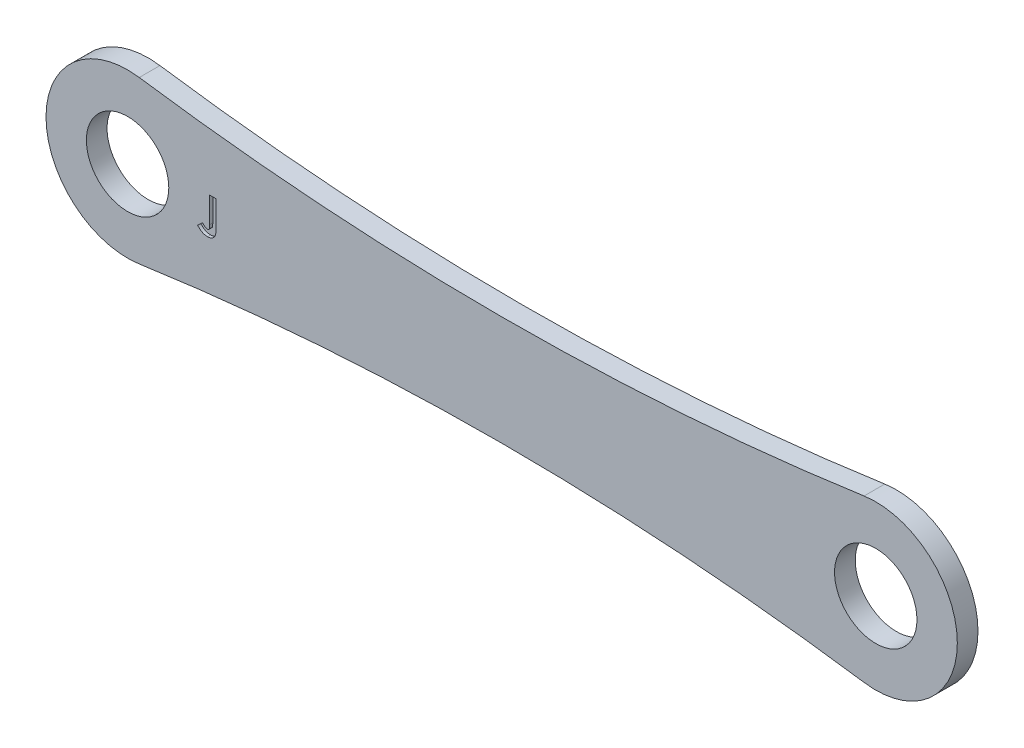
ISO-10303-21;
HEADER;
FILE_DESCRIPTION(('STEP AP214'),'2;1');
FILE_NAME('part.step','',(''),(''),'','','');
FILE_SCHEMA(('AUTOMOTIVE_DESIGN { 1 0 10303 214 1 1 1 1 }'));
ENDSEC;
DATA;
#1=APPLICATION_CONTEXT('core data for automotive mechanical design processes');
#2=APPLICATION_PROTOCOL_DEFINITION('international standard','automotive_design',2000,#1);
#3=PRODUCT_CONTEXT('',#1,'mechanical');
#4=PRODUCT('Part','Part','',(#3));
#5=PRODUCT_RELATED_PRODUCT_CATEGORY('part','',(#4));
#6=PRODUCT_DEFINITION_FORMATION('','',#4);
#7=PRODUCT_DEFINITION_CONTEXT('part definition',#1,'design');
#8=PRODUCT_DEFINITION('design','',#6,#7);
#9=PRODUCT_DEFINITION_SHAPE('','',#8);
#10=(LENGTH_UNIT() NAMED_UNIT(*) SI_UNIT(.MILLI.,.METRE.));
#11=(NAMED_UNIT(*) PLANE_ANGLE_UNIT() SI_UNIT($,.RADIAN.));
#12=(NAMED_UNIT(*) SI_UNIT($,.STERADIAN.) SOLID_ANGLE_UNIT());
#13=UNCERTAINTY_MEASURE_WITH_UNIT(LENGTH_MEASURE(1.E-05),#10,'distance_accuracy_value','');
#14=(GEOMETRIC_REPRESENTATION_CONTEXT(3) GLOBAL_UNCERTAINTY_ASSIGNED_CONTEXT((#13)) GLOBAL_UNIT_ASSIGNED_CONTEXT((#10,
#11,#12)) REPRESENTATION_CONTEXT('',''));
#15=CARTESIAN_POINT('',(0.,0.,0.));
#16=DIRECTION('',(0.,0.,1.));
#17=DIRECTION('',(1.,0.,0.));
#18=AXIS2_PLACEMENT_3D('',#15,#16,#17);
#19=CARTESIAN_POINT('',(0.,0.,2.));
#20=DIRECTION('',(0.,0.,1.));
#21=DIRECTION('',(1.,0.,0.));
#22=AXIS2_PLACEMENT_3D('',#19,#20,#21);
#23=PLANE('',#22);
#24=CARTESIAN_POINT('',(-72.36,0.,2.));
#25=DIRECTION('',(0.,0.,1.));
#26=DIRECTION('',(1.,0.,0.));
#27=AXIS2_PLACEMENT_3D('',#24,#25,#26);
#28=CIRCLE('',#27,7.89);
#29=CARTESIAN_POINT('',(-71.2312080351141,7.80883657787823,2.));
#30=VERTEX_POINT('',#29);
#31=CARTESIAN_POINT('',(-71.2312080351141,-7.80883657787824,2.));
#32=VERTEX_POINT('',#31);
#33=EDGE_CURVE('E177',#30,#32,#28,.T.);
#34=ORIENTED_EDGE('',*,*,#33,.T.);
#35=CARTESIAN_POINT('',(-36.18,-250.288552874477,2.));
#36=DIRECTION('',(0.,0.,1.));
#37=DIRECTION('',(1.,0.,0.));
#38=AXIS2_PLACEMENT_3D('',#35,#36,#37);
#39=CIRCLE('',#38,245.);
#40=CARTESIAN_POINT('',(-1.12879196488592,-7.80883657787823,2.));
#41=VERTEX_POINT('',#40);
#42=EDGE_CURVE('E94',#32,#41,#39,.F.);
#43=ORIENTED_EDGE('',*,*,#42,.T.);
#44=CARTESIAN_POINT('',(0.,0.,2.));
#45=DIRECTION('',(0.,0.,1.));
#46=DIRECTION('',(1.,0.,0.));
#47=AXIS2_PLACEMENT_3D('',#44,#45,#46);
#48=CIRCLE('',#47,7.89);
#49=CARTESIAN_POINT('',(-1.12879196488592,7.80883657787823,2.));
#50=VERTEX_POINT('',#49);
#51=EDGE_CURVE('E183',#41,#50,#48,.T.);
#52=ORIENTED_EDGE('',*,*,#51,.T.);
#53=CARTESIAN_POINT('',(-36.18,250.288552874477,2.));
#54=DIRECTION('',(0.,0.,1.));
#55=DIRECTION('',(1.,0.,0.));
#56=AXIS2_PLACEMENT_3D('',#53,#54,#55);
#57=CIRCLE('',#56,245.);
#58=EDGE_CURVE('E186',#30,#50,#57,.T.);
#59=ORIENTED_EDGE('',*,*,#58,.F.);
#60=EDGE_LOOP('',(#34,#43,#52,#59));
#61=FACE_BOUND('',#60,.T.);
#62=CARTESIAN_POINT('',(0.,0.,2.));
#63=DIRECTION('',(0.,0.,1.));
#64=DIRECTION('',(1.,0.,0.));
#65=AXIS2_PLACEMENT_3D('',#62,#63,#64);
#66=CIRCLE('',#65,3.985);
#67=CARTESIAN_POINT('',(3.985,0.,2.));
#68=VERTEX_POINT('',#67);
#69=EDGE_CURVE('E189',#68,#68,#66,.T.);
#70=ORIENTED_EDGE('',*,*,#69,.F.);
#71=EDGE_LOOP('',(#70));
#72=FACE_BOUND('',#71,.T.);
#73=CARTESIAN_POINT('',(-72.36,0.,2.));
#74=DIRECTION('',(0.,0.,1.));
#75=DIRECTION('',(1.,0.,0.));
#76=AXIS2_PLACEMENT_3D('',#73,#74,#75);
#77=CIRCLE('',#76,3.985);
#78=CARTESIAN_POINT('',(-68.375,0.,2.));
#79=VERTEX_POINT('',#78);
#80=EDGE_CURVE('E193',#79,#79,#77,.T.);
#81=ORIENTED_EDGE('',*,*,#80,.F.);
#82=EDGE_LOOP('',(#81));
#83=FACE_BOUND('',#82,.T.);
#84=CARTESIAN_POINT('',(-64.6286490353845,-1.5975658054175,2.));
#85=CARTESIAN_POINT('',(-64.6118644782961,-1.59669051779528,2.));
#86=CARTESIAN_POINT('',(-64.5795932929608,-1.59500762744972,2.));
#87=CARTESIAN_POINT('',(-64.5352191755467,-1.57630016813973,2.));
#88=CARTESIAN_POINT('',(-64.4978089389516,-1.54692867047063,2.));
#89=CARTESIAN_POINT('',(-64.4731802472815,-1.51316232263827,2.));
#90=CARTESIAN_POINT('',(-64.4574852526347,-1.47864402467006,2.));
#91=CARTESIAN_POINT('',(-64.4476787241519,-1.44527678326616,2.));
#92=CARTESIAN_POINT('',(-64.4383723116559,-1.40527850437641,2.));
#93=CARTESIAN_POINT('',(-64.4309162215116,-1.35866923476935,2.));
#94=CARTESIAN_POINT('',(-64.4252823864001,-1.3048410202096,2.));
#95=CARTESIAN_POINT('',(-64.422474326906,-1.24444733226282,2.));
#96=CARTESIAN_POINT('',(-64.419059366383,-1.17716181280407,2.));
#97=CARTESIAN_POINT('',(-64.4190294102165,-1.13015703803754,2.));
#98=CARTESIAN_POINT('',(-64.4190136187179,-1.1053783054175,2.));
#99=B_SPLINE_CURVE_WITH_KNOTS('',3,(#84,#85,#86,#87,#88,#89,#90,#91,#92,#93,#94,#95,#96,#97,
#98),.UNSPECIFIED.,.F.,.F.,(4,1,1,1,1,1,1,1,1,1,1,1,4),(0.,0.0836606106248736,0.160851850693832,
0.236744462245986,0.319647798711953,0.367325512256422,0.426209548529814,0.493524089529685,
0.573025277738405,0.662506020502808,0.764543201859917,0.875878119325883,1.),.UNSPECIFIED.);
#100=CARTESIAN_POINT('',(-64.6286490353845,-1.5975658054175,2.));
#101=VERTEX_POINT('',#100);
#102=CARTESIAN_POINT('',(-64.4190136187179,-1.1053783054175,2.));
#103=VERTEX_POINT('',#102);
#104=EDGE_CURVE('E159',#101,#103,#99,.T.);
#105=ORIENTED_EDGE('',*,*,#104,.T.);
#106=DIRECTION('',(0.,1.,0.));
#107=VECTOR('',#106,1.);
#108=CARTESIAN_POINT('',(-64.4190136187179,-1.1053783054175,2.));
#109=LINE('',#108,#107);
#110=CARTESIAN_POINT('',(-64.4190136187179,1.36397265612096,2.));
#111=VERTEX_POINT('',#110);
#112=EDGE_CURVE('E59',#103,#111,#109,.T.);
#113=ORIENTED_EDGE('',*,*,#112,.T.);
#114=DIRECTION('',(1.,0.,0.));
#115=VECTOR('',#114,1.);
#116=CARTESIAN_POINT('',(-64.4190136187179,1.36397265612096,2.));
#117=LINE('',#116,#115);
#118=CARTESIAN_POINT('',(-63.7908084905127,1.36397265612096,2.));
#119=VERTEX_POINT('',#118);
#120=EDGE_CURVE('E163',#111,#119,#117,.T.);
#121=ORIENTED_EDGE('',*,*,#120,.T.);
#122=DIRECTION('',(0.,-1.,0.));
#123=VECTOR('',#122,1.);
#124=CARTESIAN_POINT('',(-63.7908084905127,1.36397265612096,2.));
#125=LINE('',#124,#123);
#126=CARTESIAN_POINT('',(-63.7908084905127,-0.959544972084172,2.));
#127=VERTEX_POINT('',#126);
#128=EDGE_CURVE('E396',#119,#127,#125,.T.);
#129=ORIENTED_EDGE('',*,*,#128,.T.);
#130=CARTESIAN_POINT('',(-63.7908084905127,-0.959544972084172,2.));
#131=CARTESIAN_POINT('',(-63.7910388093672,-1.00395367744763,2.));
#132=CARTESIAN_POINT('',(-63.7914825883267,-1.08952048488141,2.));
#133=CARTESIAN_POINT('',(-63.7959256028876,-1.21270510131638,2.));
#134=CARTESIAN_POINT('',(-63.8019333420481,-1.32564701040238,2.));
#135=CARTESIAN_POINT('',(-63.8105850660803,-1.42816524272144,2.));
#136=CARTESIAN_POINT('',(-63.8234352450288,-1.52025484078727,2.));
#137=CARTESIAN_POINT('',(-63.8379777458225,-1.60214555967415,2.));
#138=CARTESIAN_POINT('',(-63.8540221609034,-1.67417108119235,2.));
#139=CARTESIAN_POINT('',(-63.881125114979,-1.75477884515614,2.));
#140=CARTESIAN_POINT('',(-63.9232016657711,-1.84404277443184,2.));
#141=CARTESIAN_POINT('',(-63.9866963819806,-1.94046050316093,2.));
#142=CARTESIAN_POINT('',(-64.0657676270272,-2.02423107983365,2.));
#143=CARTESIAN_POINT('',(-64.1568315829075,-2.09699550822897,2.));
#144=CARTESIAN_POINT('',(-64.2606555308491,-2.15461117125894,2.));
#145=CARTESIAN_POINT('',(-64.3748476112268,-2.19625592675418,2.));
#146=CARTESIAN_POINT('',(-64.4990427791416,-2.22113479213677,2.));
#147=CARTESIAN_POINT('',(-64.5850635498624,-2.2241952824159,2.));
#148=CARTESIAN_POINT('',(-64.6293501571794,-2.22577093362263,2.));
#149=B_SPLINE_CURVE_WITH_KNOTS('',3,(#130,#131,#132,#133,#134,#135,#136,#137,#138,#139,#140,
#141,#142,#143,#144,#145,#146,#147,#148),.UNSPECIFIED.,.F.,.F.,(4,1,1,1,1,1,1,1,1,1,1,1,1,1,1,1,
4),(0.,0.0764053506058015,0.147218025580542,0.212058993569066,0.270999490309767,
0.324170992612473,0.371969814615873,0.414105230295778,0.450981256131896,0.518077209357028,
0.583319665547199,0.64875638268336,0.715449883456708,0.783134877260214,0.852084921522462,
0.92384796204543,1.),.UNSPECIFIED.);
#150=CARTESIAN_POINT('',(-64.6293501571794,-2.22577093362263,2.));
#151=VERTEX_POINT('',#150);
#152=EDGE_CURVE('E400',#127,#151,#149,.T.);
#153=ORIENTED_EDGE('',*,*,#152,.T.);
#154=CARTESIAN_POINT('',(-64.6293501571794,-2.22577093362263,2.));
#155=CARTESIAN_POINT('',(-64.675492771988,-2.2243424113451,2.));
#156=CARTESIAN_POINT('',(-64.766504027042,-2.22152480757708,2.));
#157=CARTESIAN_POINT('',(-64.8999814055994,-2.19752605924968,2.));
#158=CARTESIAN_POINT('',(-65.0282698518428,-2.15904884462812,2.));
#159=CARTESIAN_POINT('',(-65.1507056689292,-2.10341541025847,2.));
#160=CARTESIAN_POINT('',(-65.2689662647122,-2.03372701697355,2.));
#161=CARTESIAN_POINT('',(-65.3809053177734,-1.94728534819127,2.));
#162=CARTESIAN_POINT('',(-65.4888599618125,-1.84677133919651,2.));
#163=CARTESIAN_POINT('',(-65.5528561337854,-1.76963941121248,2.));
#164=CARTESIAN_POINT('',(-65.5856802853845,-1.73007782464827,2.));
#165=B_SPLINE_CURVE_WITH_KNOTS('',3,(#154,#155,#156,#157,#158,#159,#160,#161,#162,#163,#164),
.UNSPECIFIED.,.F.,.F.,(4,1,1,1,1,1,1,1,4),(0.,0.123873098257655,0.24432612210228,
0.363091916241502,0.48280641059897,0.604690738529228,0.731012015230366,0.862033897993615,1.),.UNSPECIFIED.);
#166=CARTESIAN_POINT('',(-65.5856802853845,-1.73007782464827,2.));
#167=VERTEX_POINT('',#166);
#168=EDGE_CURVE('E406',#151,#167,#165,.T.);
#169=ORIENTED_EDGE('',*,*,#168,.T.);
#170=DIRECTION('',(0.734180402826142,0.678954443321527,0.));
#171=VECTOR('',#170,1.);
#172=CARTESIAN_POINT('',(-65.5856802853845,-1.73007782464827,2.));
#173=LINE('',#172,#171);
#174=CARTESIAN_POINT('',(-65.1103197084615,-1.29047445926366,2.));
#175=VERTEX_POINT('',#174);
#176=EDGE_CURVE('E415',#167,#175,#173,.T.);
#177=ORIENTED_EDGE('',*,*,#176,.T.);
#178=CARTESIAN_POINT('',(-65.1103197084615,-1.29047445926366,2.));
#179=CARTESIAN_POINT('',(-65.0854303651838,-1.31861727764838,2.));
#180=CARTESIAN_POINT('',(-65.0388557126807,-1.3712800567384,2.));
#181=CARTESIAN_POINT('',(-64.9686690843899,-1.43995361405017,2.));
#182=CARTESIAN_POINT('',(-64.9053569637882,-1.49512489090156,2.));
#183=CARTESIAN_POINT('',(-64.8456745905786,-1.53492042970763,2.));
#184=CARTESIAN_POINT('',(-64.7893537667527,-1.56297184202213,2.));
#185=CARTESIAN_POINT('',(-64.7351827103125,-1.58317806297695,2.));
#186=CARTESIAN_POINT('',(-64.6814728315301,-1.59461593154351,2.));
#187=CARTESIAN_POINT('',(-64.6459904479072,-1.59659739755076,2.));
#188=CARTESIAN_POINT('',(-64.6286490353845,-1.5975658054175,2.));
#189=B_SPLINE_CURVE_WITH_KNOTS('',3,(#178,#179,#180,#181,#182,#183,#184,#185,#186,#187,#188),
.UNSPECIFIED.,.F.,.F.,(4,1,1,1,1,1,1,1,4),(0.,0.19118873467612,0.357765521601639,
0.499586074062441,0.618044672839491,0.721795541859922,0.819272160926323,0.9116723373205,1.),.UNSPECIFIED.);
#190=EDGE_CURVE('E422',#175,#101,#189,.T.);
#191=ORIENTED_EDGE('',*,*,#190,.T.);
#192=EDGE_LOOP('',(#105,#113,#121,#129,#153,#169,#177,#191));
#193=FACE_BOUND('',#192,.T.);
#194=ADVANCED_FACE('F43',(#61,#72,#83,#193),#23,.T.);
#195=CARTESIAN_POINT('',(-72.36,0.,2.));
#196=DIRECTION('',(0.,0.,-1.));
#197=DIRECTION('',(-1.,0.,0.));
#198=AXIS2_PLACEMENT_3D('',#195,#196,#197);
#199=CYLINDRICAL_SURFACE('',#198,7.89);
#200=CARTESIAN_POINT('',(-72.36,0.,0.));
#201=DIRECTION('',(0.,0.,1.));
#202=DIRECTION('',(1.,0.,0.));
#203=AXIS2_PLACEMENT_3D('',#200,#201,#202);
#204=CIRCLE('',#203,7.89);
#205=CARTESIAN_POINT('',(-71.2312080351141,7.80883657787823,0.));
#206=VERTEX_POINT('',#205);
#207=CARTESIAN_POINT('',(-71.2312080351141,-7.80883657787824,0.));
#208=VERTEX_POINT('',#207);
#209=EDGE_CURVE('E165',#206,#208,#204,.T.);
#210=ORIENTED_EDGE('',*,*,#209,.T.);
#211=DIRECTION('',(0.,0.,-1.));
#212=VECTOR('',#211,1.);
#213=CARTESIAN_POINT('',(-71.2312080351141,-7.80883657787824,2.));
#214=LINE('',#213,#212);
#215=EDGE_CURVE('E11',#32,#208,#214,.T.);
#216=ORIENTED_EDGE('',*,*,#215,.F.);
#217=ORIENTED_EDGE('',*,*,#33,.F.);
#218=DIRECTION('',(0.,0.,-1.));
#219=VECTOR('',#218,1.);
#220=CARTESIAN_POINT('',(-71.2312080351141,7.80883657787823,2.));
#221=LINE('',#220,#219);
#222=EDGE_CURVE('E68',#30,#206,#221,.T.);
#223=ORIENTED_EDGE('',*,*,#222,.T.);
#224=EDGE_LOOP('',(#210,#216,#217,#223));
#225=FACE_BOUND('',#224,.T.);
#226=ADVANCED_FACE('F45',(#225),#199,.T.);
#227=CARTESIAN_POINT('',(-36.18,-250.288552874477,2.));
#228=DIRECTION('',(0.,0.,-1.));
#229=DIRECTION('',(-1.,0.,0.));
#230=AXIS2_PLACEMENT_3D('',#227,#228,#229);
#231=CYLINDRICAL_SURFACE('',#230,245.);
#232=CARTESIAN_POINT('',(-36.18,-250.288552874477,0.));
#233=DIRECTION('',(0.,0.,1.));
#234=DIRECTION('',(1.,0.,0.));
#235=AXIS2_PLACEMENT_3D('',#232,#233,#234);
#236=CIRCLE('',#235,245.);
#237=CARTESIAN_POINT('',(-1.12879196488592,-7.80883657787823,0.));
#238=VERTEX_POINT('',#237);
#239=EDGE_CURVE('E171',#208,#238,#236,.F.);
#240=ORIENTED_EDGE('',*,*,#239,.T.);
#241=DIRECTION('',(0.,0.,-1.));
#242=VECTOR('',#241,1.);
#243=CARTESIAN_POINT('',(-1.12879196488592,-7.80883657787823,2.));
#244=LINE('',#243,#242);
#245=EDGE_CURVE('E52',#41,#238,#244,.T.);
#246=ORIENTED_EDGE('',*,*,#245,.F.);
#247=ORIENTED_EDGE('',*,*,#42,.F.);
#248=ORIENTED_EDGE('',*,*,#215,.T.);
#249=EDGE_LOOP('',(#240,#246,#247,#248));
#250=FACE_BOUND('',#249,.T.);
#251=ADVANCED_FACE('F234',(#250),#231,.F.);
#252=CARTESIAN_POINT('',(0.,0.,2.));
#253=DIRECTION('',(0.,0.,-1.));
#254=DIRECTION('',(-1.,0.,0.));
#255=AXIS2_PLACEMENT_3D('',#252,#253,#254);
#256=CYLINDRICAL_SURFACE('',#255,7.89);
#257=CARTESIAN_POINT('',(0.,0.,0.));
#258=DIRECTION('',(0.,0.,1.));
#259=DIRECTION('',(1.,0.,0.));
#260=AXIS2_PLACEMENT_3D('',#257,#258,#259);
#261=CIRCLE('',#260,7.89);
#262=CARTESIAN_POINT('',(-1.12879196488592,7.80883657787823,0.));
#263=VERTEX_POINT('',#262);
#264=EDGE_CURVE('E199',#238,#263,#261,.T.);
#265=ORIENTED_EDGE('',*,*,#264,.T.);
#266=DIRECTION('',(0.,0.,-1.));
#267=VECTOR('',#266,1.);
#268=CARTESIAN_POINT('',(-1.12879196488592,7.80883657787823,2.));
#269=LINE('',#268,#267);
#270=EDGE_CURVE('E216',#50,#263,#269,.T.);
#271=ORIENTED_EDGE('',*,*,#270,.F.);
#272=ORIENTED_EDGE('',*,*,#51,.F.);
#273=ORIENTED_EDGE('',*,*,#245,.T.);
#274=EDGE_LOOP('',(#265,#271,#272,#273));
#275=FACE_BOUND('',#274,.T.);
#276=ADVANCED_FACE('F224',(#275),#256,.T.);
#277=CARTESIAN_POINT('',(0.,0.,2.));
#278=DIRECTION('',(0.,0.,-1.));
#279=DIRECTION('',(-1.,0.,0.));
#280=AXIS2_PLACEMENT_3D('',#277,#278,#279);
#281=CYLINDRICAL_SURFACE('',#280,3.985);
#282=ORIENTED_EDGE('',*,*,#69,.T.);
#283=EDGE_LOOP('',(#282));
#284=FACE_BOUND('',#283,.T.);
#285=CARTESIAN_POINT('',(0.,0.,0.));
#286=DIRECTION('',(0.,0.,1.));
#287=DIRECTION('',(1.,0.,0.));
#288=AXIS2_PLACEMENT_3D('',#285,#286,#287);
#289=CIRCLE('',#288,3.985);
#290=CARTESIAN_POINT('',(3.985,0.,0.));
#291=VERTEX_POINT('',#290);
#292=EDGE_CURVE('E207',#291,#291,#289,.T.);
#293=ORIENTED_EDGE('',*,*,#292,.F.);
#294=EDGE_LOOP('',(#293));
#295=FACE_BOUND('',#294,.T.);
#296=ADVANCED_FACE('F240',(#284,#295),#281,.F.);
#297=CARTESIAN_POINT('',(-36.18,250.288552874477,2.));
#298=DIRECTION('',(0.,0.,-1.));
#299=DIRECTION('',(-1.,0.,0.));
#300=AXIS2_PLACEMENT_3D('',#297,#298,#299);
#301=CYLINDRICAL_SURFACE('',#300,245.);
#302=CARTESIAN_POINT('',(-36.18,250.288552874477,0.));
#303=DIRECTION('',(0.,0.,1.));
#304=DIRECTION('',(1.,0.,0.));
#305=AXIS2_PLACEMENT_3D('',#302,#303,#304);
#306=CIRCLE('',#305,245.);
#307=EDGE_CURVE('E203',#206,#263,#306,.T.);
#308=ORIENTED_EDGE('',*,*,#307,.F.);
#309=ORIENTED_EDGE('',*,*,#222,.F.);
#310=ORIENTED_EDGE('',*,*,#58,.T.);
#311=ORIENTED_EDGE('',*,*,#270,.T.);
#312=EDGE_LOOP('',(#308,#309,#310,#311));
#313=FACE_BOUND('',#312,.T.);
#314=ADVANCED_FACE('F229',(#313),#301,.F.);
#315=CARTESIAN_POINT('',(-72.36,0.,2.));
#316=DIRECTION('',(0.,0.,-1.));
#317=DIRECTION('',(-1.,0.,0.));
#318=AXIS2_PLACEMENT_3D('',#315,#316,#317);
#319=CYLINDRICAL_SURFACE('',#318,3.985);
#320=ORIENTED_EDGE('',*,*,#80,.T.);
#321=EDGE_LOOP('',(#320));
#322=FACE_BOUND('',#321,.T.);
#323=CARTESIAN_POINT('',(-72.36,0.,0.));
#324=DIRECTION('',(0.,0.,1.));
#325=DIRECTION('',(1.,0.,0.));
#326=AXIS2_PLACEMENT_3D('',#323,#324,#325);
#327=CIRCLE('',#326,3.985);
#328=CARTESIAN_POINT('',(-68.375,0.,0.));
#329=VERTEX_POINT('',#328);
#330=EDGE_CURVE('E180',#329,#329,#327,.T.);
#331=ORIENTED_EDGE('',*,*,#330,.F.);
#332=EDGE_LOOP('',(#331));
#333=FACE_BOUND('',#332,.T.);
#334=ADVANCED_FACE('F252',(#322,#333),#319,.F.);
#335=CARTESIAN_POINT('',(0.,0.,0.));
#336=DIRECTION('',(0.,0.,1.));
#337=DIRECTION('',(1.,0.,0.));
#338=AXIS2_PLACEMENT_3D('',#335,#336,#337);
#339=PLANE('',#338);
#340=ORIENTED_EDGE('',*,*,#209,.F.);
#341=ORIENTED_EDGE('',*,*,#307,.T.);
#342=ORIENTED_EDGE('',*,*,#264,.F.);
#343=ORIENTED_EDGE('',*,*,#239,.F.);
#344=EDGE_LOOP('',(#340,#341,#342,#343));
#345=FACE_BOUND('',#344,.T.);
#346=ORIENTED_EDGE('',*,*,#292,.T.);
#347=EDGE_LOOP('',(#346));
#348=FACE_BOUND('',#347,.T.);
#349=ORIENTED_EDGE('',*,*,#330,.T.);
#350=EDGE_LOOP('',(#349));
#351=FACE_BOUND('',#350,.T.);
#352=ADVANCED_FACE('F227',(#345,#348,#351),#339,.F.);
#353=CARTESIAN_POINT('',(-64.4190136187179,-1.1053783054175,1.7));
#354=DIRECTION('',(1.,0.,0.));
#355=DIRECTION('',(0.,0.,-1.));
#356=AXIS2_PLACEMENT_3D('',#353,#354,#355);
#357=PLANE('',#356);
#358=ORIENTED_EDGE('',*,*,#112,.F.);
#359=DIRECTION('',(0.,0.,1.));
#360=VECTOR('',#359,1.);
#361=CARTESIAN_POINT('',(-64.4190136187179,-1.1053783054175,1.7));
#362=LINE('',#361,#360);
#363=CARTESIAN_POINT('',(-64.4190136187179,-1.1053783054175,1.7));
#364=VERTEX_POINT('',#363);
#365=EDGE_CURVE('E157',#364,#103,#362,.T.);
#366=ORIENTED_EDGE('',*,*,#365,.F.);
#367=DIRECTION('',(0.,1.,0.));
#368=VECTOR('',#367,1.);
#369=CARTESIAN_POINT('',(-64.4190136187179,-1.1053783054175,1.7));
#370=LINE('',#369,#368);
#371=CARTESIAN_POINT('',(-64.4190136187179,1.36397265612096,1.7));
#372=VERTEX_POINT('',#371);
#373=EDGE_CURVE('E147',#364,#372,#370,.T.);
#374=ORIENTED_EDGE('',*,*,#373,.T.);
#375=DIRECTION('',(0.,0.,1.));
#376=VECTOR('',#375,1.);
#377=CARTESIAN_POINT('',(-64.4190136187179,1.36397265612096,1.7));
#378=LINE('',#377,#376);
#379=EDGE_CURVE('E156',#372,#111,#378,.T.);
#380=ORIENTED_EDGE('',*,*,#379,.T.);
#381=EDGE_LOOP('',(#358,#366,#374,#380));
#382=FACE_BOUND('',#381,.T.);
#383=ADVANCED_FACE('F155',(#382),#357,.T.);
#384=CARTESIAN_POINT('',(-64.4190136187179,1.36397265612096,1.7));
#385=DIRECTION('',(0.,-1.,0.));
#386=DIRECTION('',(0.,0.,-1.));
#387=AXIS2_PLACEMENT_3D('',#384,#385,#386);
#388=PLANE('',#387);
#389=ORIENTED_EDGE('',*,*,#120,.F.);
#390=ORIENTED_EDGE('',*,*,#379,.F.);
#391=DIRECTION('',(1.,0.,0.));
#392=VECTOR('',#391,1.);
#393=CARTESIAN_POINT('',(-64.4190136187179,1.36397265612096,1.7));
#394=LINE('',#393,#392);
#395=CARTESIAN_POINT('',(-63.7908084905127,1.36397265612096,1.7));
#396=VERTEX_POINT('',#395);
#397=EDGE_CURVE('E143',#372,#396,#394,.T.);
#398=ORIENTED_EDGE('',*,*,#397,.T.);
#399=DIRECTION('',(0.,0.,1.));
#400=VECTOR('',#399,1.);
#401=CARTESIAN_POINT('',(-63.7908084905127,1.36397265612096,1.7));
#402=LINE('',#401,#400);
#403=EDGE_CURVE('E166',#396,#119,#402,.T.);
#404=ORIENTED_EDGE('',*,*,#403,.T.);
#405=EDGE_LOOP('',(#389,#390,#398,#404));
#406=FACE_BOUND('',#405,.T.);
#407=ADVANCED_FACE('F161',(#406),#388,.T.);
#408=CARTESIAN_POINT('',(-63.7908084905127,1.36397265612096,1.7));
#409=DIRECTION('',(-1.,0.,0.));
#410=DIRECTION('',(0.,0.,1.));
#411=AXIS2_PLACEMENT_3D('',#408,#409,#410);
#412=PLANE('',#411);
#413=ORIENTED_EDGE('',*,*,#128,.F.);
#414=ORIENTED_EDGE('',*,*,#403,.F.);
#415=DIRECTION('',(0.,-1.,0.));
#416=VECTOR('',#415,1.);
#417=CARTESIAN_POINT('',(-63.7908084905127,1.36397265612096,1.7));
#418=LINE('',#417,#416);
#419=CARTESIAN_POINT('',(-63.7908084905127,-0.959544972084172,1.7));
#420=VERTEX_POINT('',#419);
#421=EDGE_CURVE('E149',#396,#420,#418,.T.);
#422=ORIENTED_EDGE('',*,*,#421,.T.);
#423=DIRECTION('',(0.,0.,1.));
#424=VECTOR('',#423,1.);
#425=CARTESIAN_POINT('',(-63.7908084905127,-0.959544972084172,1.7));
#426=LINE('',#425,#424);
#427=EDGE_CURVE('E173',#420,#127,#426,.T.);
#428=ORIENTED_EDGE('',*,*,#427,.T.);
#429=EDGE_LOOP('',(#413,#414,#422,#428));
#430=FACE_BOUND('',#429,.T.);
#431=ADVANCED_FACE('F307',(#430),#412,.T.);
#432=CARTESIAN_POINT('',(-63.7908084905127,-0.959544972084172,1.7));
#433=CARTESIAN_POINT('',(-63.7910388093672,-1.00395367744763,1.7));
#434=CARTESIAN_POINT('',(-63.7914825883267,-1.08952048488141,1.7));
#435=CARTESIAN_POINT('',(-63.7959256028876,-1.21270510131638,1.7));
#436=CARTESIAN_POINT('',(-63.8019333420481,-1.32564701040238,1.7));
#437=CARTESIAN_POINT('',(-63.8105850660803,-1.42816524272144,1.7));
#438=CARTESIAN_POINT('',(-63.8234352450288,-1.52025484078727,1.7));
#439=CARTESIAN_POINT('',(-63.8379777458225,-1.60214555967415,1.7));
#440=CARTESIAN_POINT('',(-63.8540221609034,-1.67417108119235,1.7));
#441=CARTESIAN_POINT('',(-63.881125114979,-1.75477884515614,1.7));
#442=CARTESIAN_POINT('',(-63.9232016657711,-1.84404277443184,1.7));
#443=CARTESIAN_POINT('',(-63.9866963819806,-1.94046050316093,1.7));
#444=CARTESIAN_POINT('',(-64.0657676270272,-2.02423107983365,1.7));
#445=CARTESIAN_POINT('',(-64.1568315829075,-2.09699550822897,1.7));
#446=CARTESIAN_POINT('',(-64.2606555308491,-2.15461117125894,1.7));
#447=CARTESIAN_POINT('',(-64.3748476112268,-2.19625592675418,1.7));
#448=CARTESIAN_POINT('',(-64.4990427791416,-2.22113479213677,1.7));
#449=CARTESIAN_POINT('',(-64.5850635498624,-2.2241952824159,1.7));
#450=CARTESIAN_POINT('',(-64.6293501571794,-2.22577093362263,1.7));
#451=B_SPLINE_CURVE_WITH_KNOTS('',3,(#432,#433,#434,#435,#436,#437,#438,#439,#440,#441,#442,
#443,#444,#445,#446,#447,#448,#449,#450),.UNSPECIFIED.,.F.,.F.,(4,1,1,1,1,1,1,1,1,1,1,1,1,1,1,1,
4),(0.,0.0764053506058015,0.147218025580542,0.212058993569066,0.270999490309767,
0.324170992612473,0.371969814615873,0.414105230295778,0.450981256131896,0.518077209357028,
0.583319665547199,0.64875638268336,0.715449883456708,0.783134877260214,0.852084921522462,
0.92384796204543,1.),.UNSPECIFIED.);
#452=DIRECTION('',(0.,0.,1.));
#453=VECTOR('',#452,1.);
#454=SURFACE_OF_LINEAR_EXTRUSION('',#451,#453);
#455=ORIENTED_EDGE('',*,*,#152,.F.);
#456=ORIENTED_EDGE('',*,*,#427,.F.);
#457=CARTESIAN_POINT('',(-64.6293501571794,-2.22577093362263,1.7));
#458=VERTEX_POINT('',#457);
#459=EDGE_CURVE('E475',#420,#458,#451,.T.);
#460=ORIENTED_EDGE('',*,*,#459,.T.);
#461=DIRECTION('',(0.,0.,1.));
#462=VECTOR('',#461,1.);
#463=CARTESIAN_POINT('',(-64.6293501571794,-2.22577093362263,1.7));
#464=LINE('',#463,#462);
#465=EDGE_CURVE('E450',#458,#151,#464,.T.);
#466=ORIENTED_EDGE('',*,*,#465,.T.);
#467=EDGE_LOOP('',(#455,#456,#460,#466));
#468=FACE_BOUND('',#467,.T.);
#469=ADVANCED_FACE('F315',(#468),#454,.T.);
#470=CARTESIAN_POINT('',(-64.6293501571794,-2.22577093362263,1.7));
#471=CARTESIAN_POINT('',(-64.675492771988,-2.2243424113451,1.7));
#472=CARTESIAN_POINT('',(-64.766504027042,-2.22152480757708,1.7));
#473=CARTESIAN_POINT('',(-64.8999814055994,-2.19752605924968,1.7));
#474=CARTESIAN_POINT('',(-65.0282698518428,-2.15904884462812,1.7));
#475=CARTESIAN_POINT('',(-65.1507056689292,-2.10341541025847,1.7));
#476=CARTESIAN_POINT('',(-65.2689662647122,-2.03372701697355,1.7));
#477=CARTESIAN_POINT('',(-65.3809053177734,-1.94728534819127,1.7));
#478=CARTESIAN_POINT('',(-65.4888599618125,-1.84677133919651,1.7));
#479=CARTESIAN_POINT('',(-65.5528561337854,-1.76963941121248,1.7));
#480=CARTESIAN_POINT('',(-65.5856802853845,-1.73007782464827,1.7));
#481=B_SPLINE_CURVE_WITH_KNOTS('',3,(#470,#471,#472,#473,#474,#475,#476,#477,#478,#479,#480),
.UNSPECIFIED.,.F.,.F.,(4,1,1,1,1,1,1,1,4),(0.,0.123873098257655,0.24432612210228,
0.363091916241502,0.48280641059897,0.604690738529228,0.731012015230366,0.862033897993615,1.),.UNSPECIFIED.);
#482=DIRECTION('',(0.,0.,1.));
#483=VECTOR('',#482,1.);
#484=SURFACE_OF_LINEAR_EXTRUSION('',#481,#483);
#485=ORIENTED_EDGE('',*,*,#168,.F.);
#486=ORIENTED_EDGE('',*,*,#465,.F.);
#487=CARTESIAN_POINT('',(-65.5856802853845,-1.73007782464827,1.7));
#488=VERTEX_POINT('',#487);
#489=EDGE_CURVE('E471',#458,#488,#481,.T.);
#490=ORIENTED_EDGE('',*,*,#489,.T.);
#491=DIRECTION('',(0.,0.,1.));
#492=VECTOR('',#491,1.);
#493=CARTESIAN_POINT('',(-65.5856802853845,-1.73007782464827,1.7));
#494=LINE('',#493,#492);
#495=EDGE_CURVE('E447',#488,#167,#494,.T.);
#496=ORIENTED_EDGE('',*,*,#495,.T.);
#497=EDGE_LOOP('',(#485,#486,#490,#496));
#498=FACE_BOUND('',#497,.T.);
#499=ADVANCED_FACE('F325',(#498),#484,.T.);
#500=CARTESIAN_POINT('',(-65.5856802853845,-1.73007782464827,1.7));
#501=DIRECTION('',(0.678954443321527,-0.734180402826142,0.));
#502=DIRECTION('',(0.734180402826142,0.678954443321527,0.));
#503=AXIS2_PLACEMENT_3D('',#500,#501,#502);
#504=PLANE('',#503);
#505=ORIENTED_EDGE('',*,*,#176,.F.);
#506=ORIENTED_EDGE('',*,*,#495,.F.);
#507=DIRECTION('',(0.734180402826142,0.678954443321527,0.));
#508=VECTOR('',#507,1.);
#509=CARTESIAN_POINT('',(-65.5856802853845,-1.73007782464827,1.7));
#510=LINE('',#509,#508);
#511=CARTESIAN_POINT('',(-65.1103197084615,-1.29047445926366,1.7));
#512=VERTEX_POINT('',#511);
#513=EDGE_CURVE('E466',#488,#512,#510,.T.);
#514=ORIENTED_EDGE('',*,*,#513,.T.);
#515=DIRECTION('',(0.,0.,1.));
#516=VECTOR('',#515,1.);
#517=CARTESIAN_POINT('',(-65.1103197084615,-1.29047445926366,1.7));
#518=LINE('',#517,#516);
#519=EDGE_CURVE('E444',#512,#175,#518,.T.);
#520=ORIENTED_EDGE('',*,*,#519,.T.);
#521=EDGE_LOOP('',(#505,#506,#514,#520));
#522=FACE_BOUND('',#521,.T.);
#523=ADVANCED_FACE('F335',(#522),#504,.T.);
#524=CARTESIAN_POINT('',(-65.1103197084615,-1.29047445926366,1.7));
#525=CARTESIAN_POINT('',(-65.0854303651838,-1.31861727764838,1.7));
#526=CARTESIAN_POINT('',(-65.0388557126807,-1.3712800567384,1.7));
#527=CARTESIAN_POINT('',(-64.9686690843899,-1.43995361405017,1.7));
#528=CARTESIAN_POINT('',(-64.9053569637882,-1.49512489090156,1.7));
#529=CARTESIAN_POINT('',(-64.8456745905786,-1.53492042970763,1.7));
#530=CARTESIAN_POINT('',(-64.7893537667527,-1.56297184202213,1.7));
#531=CARTESIAN_POINT('',(-64.7351827103125,-1.58317806297695,1.7));
#532=CARTESIAN_POINT('',(-64.6814728315301,-1.59461593154351,1.7));
#533=CARTESIAN_POINT('',(-64.6459904479072,-1.59659739755076,1.7));
#534=CARTESIAN_POINT('',(-64.6286490353845,-1.5975658054175,1.7));
#535=B_SPLINE_CURVE_WITH_KNOTS('',3,(#524,#525,#526,#527,#528,#529,#530,#531,#532,#533,#534),
.UNSPECIFIED.,.F.,.F.,(4,1,1,1,1,1,1,1,4),(0.,0.19118873467612,0.357765521601639,
0.499586074062441,0.618044672839491,0.721795541859922,0.819272160926323,0.9116723373205,1.),.UNSPECIFIED.);
#536=DIRECTION('',(0.,0.,1.));
#537=VECTOR('',#536,1.);
#538=SURFACE_OF_LINEAR_EXTRUSION('',#535,#537);
#539=ORIENTED_EDGE('',*,*,#190,.F.);
#540=ORIENTED_EDGE('',*,*,#519,.F.);
#541=CARTESIAN_POINT('',(-64.6286490353845,-1.5975658054175,1.7));
#542=VERTEX_POINT('',#541);
#543=EDGE_CURVE('E384',#512,#542,#535,.T.);
#544=ORIENTED_EDGE('',*,*,#543,.T.);
#545=DIRECTION('',(0.,0.,1.));
#546=VECTOR('',#545,1.);
#547=CARTESIAN_POINT('',(-64.6286490353845,-1.5975658054175,1.7));
#548=LINE('',#547,#546);
#549=EDGE_CURVE('E441',#542,#101,#548,.T.);
#550=ORIENTED_EDGE('',*,*,#549,.T.);
#551=EDGE_LOOP('',(#539,#540,#544,#550));
#552=FACE_BOUND('',#551,.T.);
#553=ADVANCED_FACE('F345',(#552),#538,.T.);
#554=CARTESIAN_POINT('',(-64.6286490353845,-1.5975658054175,1.7));
#555=CARTESIAN_POINT('',(-64.6118644782961,-1.59669051779528,1.7));
#556=CARTESIAN_POINT('',(-64.5795932929608,-1.59500762744972,1.7));
#557=CARTESIAN_POINT('',(-64.5352191755467,-1.57630016813973,1.7));
#558=CARTESIAN_POINT('',(-64.4978089389516,-1.54692867047063,1.7));
#559=CARTESIAN_POINT('',(-64.4731802472815,-1.51316232263827,1.7));
#560=CARTESIAN_POINT('',(-64.4574852526347,-1.47864402467006,1.7));
#561=CARTESIAN_POINT('',(-64.4476787241519,-1.44527678326616,1.7));
#562=CARTESIAN_POINT('',(-64.4383723116559,-1.40527850437641,1.7));
#563=CARTESIAN_POINT('',(-64.4309162215116,-1.35866923476935,1.7));
#564=CARTESIAN_POINT('',(-64.4252823864001,-1.3048410202096,1.7));
#565=CARTESIAN_POINT('',(-64.422474326906,-1.24444733226282,1.7));
#566=CARTESIAN_POINT('',(-64.419059366383,-1.17716181280407,1.7));
#567=CARTESIAN_POINT('',(-64.4190294102165,-1.13015703803754,1.7));
#568=CARTESIAN_POINT('',(-64.4190136187179,-1.1053783054175,1.7));
#569=B_SPLINE_CURVE_WITH_KNOTS('',3,(#554,#555,#556,#557,#558,#559,#560,#561,#562,#563,#564,
#565,#566,#567,#568),.UNSPECIFIED.,.F.,.F.,(4,1,1,1,1,1,1,1,1,1,1,1,4),(0.,0.0836606106248736,
0.160851850693832,0.236744462245986,0.319647798711953,0.367325512256422,0.426209548529814,
0.493524089529685,0.573025277738405,0.662506020502808,0.764543201859917,0.875878119325883,1.),.UNSPECIFIED.);
#570=DIRECTION('',(0.,0.,1.));
#571=VECTOR('',#570,1.);
#572=SURFACE_OF_LINEAR_EXTRUSION('',#569,#571);
#573=ORIENTED_EDGE('',*,*,#104,.F.);
#574=ORIENTED_EDGE('',*,*,#549,.F.);
#575=EDGE_CURVE('E378',#542,#364,#569,.T.);
#576=ORIENTED_EDGE('',*,*,#575,.T.);
#577=ORIENTED_EDGE('',*,*,#365,.T.);
#578=EDGE_LOOP('',(#573,#574,#576,#577));
#579=FACE_BOUND('',#578,.T.);
#580=ADVANCED_FACE('F355',(#579),#572,.T.);
#581=CARTESIAN_POINT('',(-63.9111911029897,-1.81586110816089,1.7));
#582=DIRECTION('',(0.,0.,1.));
#583=DIRECTION('',(1.,0.,0.));
#584=AXIS2_PLACEMENT_3D('',#581,#582,#583);
#585=PLANE('',#584);
#586=ORIENTED_EDGE('',*,*,#373,.F.);
#587=ORIENTED_EDGE('',*,*,#575,.F.);
#588=ORIENTED_EDGE('',*,*,#543,.F.);
#589=ORIENTED_EDGE('',*,*,#513,.F.);
#590=ORIENTED_EDGE('',*,*,#489,.F.);
#591=ORIENTED_EDGE('',*,*,#459,.F.);
#592=ORIENTED_EDGE('',*,*,#421,.F.);
#593=ORIENTED_EDGE('',*,*,#397,.F.);
#594=EDGE_LOOP('',(#586,#587,#588,#589,#590,#591,#592,#593));
#595=FACE_BOUND('',#594,.T.);
#596=ADVANCED_FACE('F145',(#595),#585,.T.);
#597=CLOSED_SHELL('',(#194,#226,#251,#276,#296,#314,#334,#352,#383,#407,#431,#469,#499,#523,
#553,#580,#596));
#598=MANIFOLD_SOLID_BREP('B2',#597);
#599=ADVANCED_BREP_SHAPE_REPRESENTATION('',(#18,#598),#14);
#600=SHAPE_DEFINITION_REPRESENTATION(#9,#599);
ENDSEC;
END-ISO-10303-21;
